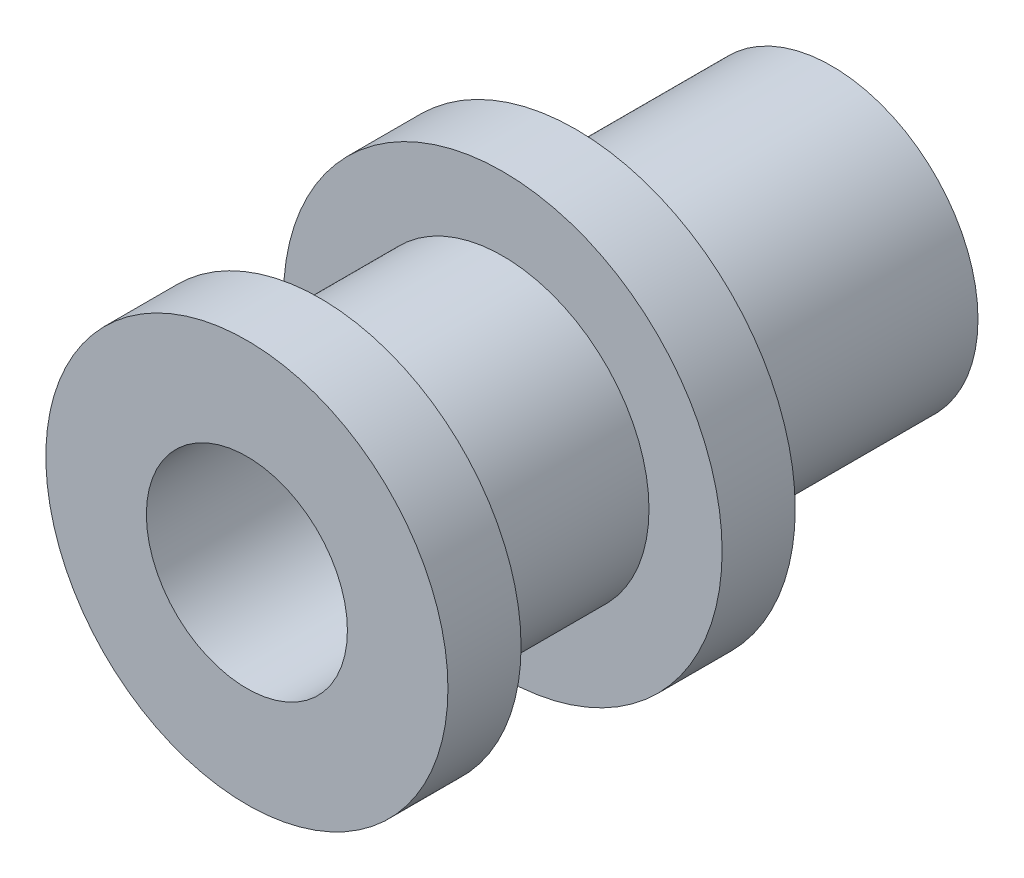
ISO-10303-21;
HEADER;
FILE_DESCRIPTION(('STEP AP214'),'2;1');
FILE_NAME('part.step','',(''),(''),'','','');
FILE_SCHEMA(('AUTOMOTIVE_DESIGN { 1 0 10303 214 1 1 1 1 }'));
ENDSEC;
DATA;
#1=APPLICATION_CONTEXT('core data for automotive mechanical design processes');
#2=APPLICATION_PROTOCOL_DEFINITION('international standard','automotive_design',2000,#1);
#3=PRODUCT_CONTEXT('',#1,'mechanical');
#4=PRODUCT('Part','Part','',(#3));
#5=PRODUCT_RELATED_PRODUCT_CATEGORY('part','',(#4));
#6=PRODUCT_DEFINITION_FORMATION('','',#4);
#7=PRODUCT_DEFINITION_CONTEXT('part definition',#1,'design');
#8=PRODUCT_DEFINITION('design','',#6,#7);
#9=PRODUCT_DEFINITION_SHAPE('','',#8);
#10=(LENGTH_UNIT() NAMED_UNIT(*) SI_UNIT(.MILLI.,.METRE.));
#11=(NAMED_UNIT(*) PLANE_ANGLE_UNIT() SI_UNIT($,.RADIAN.));
#12=(NAMED_UNIT(*) SI_UNIT($,.STERADIAN.) SOLID_ANGLE_UNIT());
#13=UNCERTAINTY_MEASURE_WITH_UNIT(LENGTH_MEASURE(1.E-05),#10,'distance_accuracy_value','');
#14=(GEOMETRIC_REPRESENTATION_CONTEXT(3) GLOBAL_UNCERTAINTY_ASSIGNED_CONTEXT((#13)) GLOBAL_UNIT_ASSIGNED_CONTEXT((#10,
#11,#12)) REPRESENTATION_CONTEXT('',''));
#15=CARTESIAN_POINT('',(0.,0.,0.));
#16=DIRECTION('',(0.,0.,1.));
#17=DIRECTION('',(1.,0.,0.));
#18=AXIS2_PLACEMENT_3D('',#15,#16,#17);
#19=CARTESIAN_POINT('',(0.,0.,2.));
#20=DIRECTION('',(0.,0.,-1.));
#21=DIRECTION('',(-1.,0.,0.));
#22=AXIS2_PLACEMENT_3D('',#19,#20,#21);
#23=CYLINDRICAL_SURFACE('',#22,5.5);
#24=CARTESIAN_POINT('',(0.,0.,2.));
#25=DIRECTION('',(0.,0.,1.));
#26=DIRECTION('',(1.,0.,0.));
#27=AXIS2_PLACEMENT_3D('',#24,#25,#26);
#28=CIRCLE('',#27,5.5);
#29=CARTESIAN_POINT('',(5.5,0.,2.));
#30=VERTEX_POINT('',#29);
#31=EDGE_CURVE('E48',#30,#30,#28,.T.);
#32=ORIENTED_EDGE('',*,*,#31,.F.);
#33=EDGE_LOOP('',(#32));
#34=FACE_BOUND('',#33,.T.);
#35=CARTESIAN_POINT('',(0.,0.,0.));
#36=DIRECTION('',(0.,0.,1.));
#37=DIRECTION('',(1.,0.,0.));
#38=AXIS2_PLACEMENT_3D('',#35,#36,#37);
#39=CIRCLE('',#38,5.5);
#40=CARTESIAN_POINT('',(5.5,0.,0.));
#41=VERTEX_POINT('',#40);
#42=EDGE_CURVE('E55',#41,#41,#39,.T.);
#43=ORIENTED_EDGE('',*,*,#42,.T.);
#44=EDGE_LOOP('',(#43));
#45=FACE_BOUND('',#44,.T.);
#46=ADVANCED_FACE('F41',(#34,#45),#23,.T.);
#47=CARTESIAN_POINT('',(0.,0.,2.));
#48=DIRECTION('',(0.,0.,1.));
#49=DIRECTION('',(1.,0.,0.));
#50=AXIS2_PLACEMENT_3D('',#47,#48,#49);
#51=PLANE('',#50);
#52=CARTESIAN_POINT('',(0.,0.,2.));
#53=DIRECTION('',(0.,0.,1.));
#54=DIRECTION('',(1.,0.,0.));
#55=AXIS2_PLACEMENT_3D('',#52,#53,#54);
#56=CIRCLE('',#55,2.75);
#57=CARTESIAN_POINT('',(2.75,0.,2.));
#58=VERTEX_POINT('',#57);
#59=EDGE_CURVE('E68',#58,#58,#56,.T.);
#60=ORIENTED_EDGE('',*,*,#59,.F.);
#61=EDGE_LOOP('',(#60));
#62=FACE_BOUND('',#61,.T.);
#63=ORIENTED_EDGE('',*,*,#31,.T.);
#64=EDGE_LOOP('',(#63));
#65=FACE_BOUND('',#64,.T.);
#66=ADVANCED_FACE('F83',(#62,#65),#51,.T.);
#67=CARTESIAN_POINT('',(0.,0.,0.));
#68=DIRECTION('',(0.,0.,1.));
#69=DIRECTION('',(1.,0.,0.));
#70=AXIS2_PLACEMENT_3D('',#67,#68,#69);
#71=PLANE('',#70);
#72=CARTESIAN_POINT('',(0.,0.,0.));
#73=DIRECTION('',(0.,0.,1.));
#74=DIRECTION('',(1.,0.,0.));
#75=AXIS2_PLACEMENT_3D('',#72,#73,#74);
#76=CIRCLE('',#75,4.);
#77=CARTESIAN_POINT('',(4.,0.,0.));
#78=VERTEX_POINT('',#77);
#79=EDGE_CURVE('E57',#78,#78,#76,.T.);
#80=ORIENTED_EDGE('',*,*,#79,.T.);
#81=EDGE_LOOP('',(#80));
#82=FACE_BOUND('',#81,.T.);
#83=ORIENTED_EDGE('',*,*,#42,.F.);
#84=EDGE_LOOP('',(#83));
#85=FACE_BOUND('',#84,.T.);
#86=ADVANCED_FACE('F86',(#82,#85),#71,.F.);
#87=CARTESIAN_POINT('',(0.,0.,0.));
#88=DIRECTION('',(0.,0.,-1.));
#89=DIRECTION('',(-1.,0.,0.));
#90=AXIS2_PLACEMENT_3D('',#87,#88,#89);
#91=CYLINDRICAL_SURFACE('',#90,4.);
#92=CARTESIAN_POINT('',(0.,0.,-5.));
#93=DIRECTION('',(0.,0.,1.));
#94=DIRECTION('',(1.,0.,0.));
#95=AXIS2_PLACEMENT_3D('',#92,#93,#94);
#96=CIRCLE('',#95,4.);
#97=CARTESIAN_POINT('',(4.,0.,-5.));
#98=VERTEX_POINT('',#97);
#99=EDGE_CURVE('E42',#98,#98,#96,.T.);
#100=ORIENTED_EDGE('',*,*,#99,.T.);
#101=EDGE_LOOP('',(#100));
#102=FACE_BOUND('',#101,.T.);
#103=ORIENTED_EDGE('',*,*,#79,.F.);
#104=EDGE_LOOP('',(#103));
#105=FACE_BOUND('',#104,.T.);
#106=ADVANCED_FACE('F100',(#102,#105),#91,.T.);
#107=CARTESIAN_POINT('',(0.,0.,-5.));
#108=DIRECTION('',(0.,0.,-1.));
#109=DIRECTION('',(-1.,0.,0.));
#110=AXIS2_PLACEMENT_3D('',#107,#108,#109);
#111=CYLINDRICAL_SURFACE('',#110,6.);
#112=CARTESIAN_POINT('',(0.,0.,-5.));
#113=DIRECTION('',(0.,0.,1.));
#114=DIRECTION('',(1.,0.,0.));
#115=AXIS2_PLACEMENT_3D('',#112,#113,#114);
#116=CIRCLE('',#115,6.);
#117=CARTESIAN_POINT('',(6.,0.,-5.));
#118=VERTEX_POINT('',#117);
#119=EDGE_CURVE('E67',#118,#118,#116,.T.);
#120=ORIENTED_EDGE('',*,*,#119,.F.);
#121=EDGE_LOOP('',(#120));
#122=FACE_BOUND('',#121,.T.);
#123=CARTESIAN_POINT('',(0.,0.,-7.));
#124=DIRECTION('',(0.,0.,1.));
#125=DIRECTION('',(1.,0.,0.));
#126=AXIS2_PLACEMENT_3D('',#123,#124,#125);
#127=CIRCLE('',#126,6.);
#128=CARTESIAN_POINT('',(6.,0.,-7.));
#129=VERTEX_POINT('',#128);
#130=EDGE_CURVE('E62',#129,#129,#127,.T.);
#131=ORIENTED_EDGE('',*,*,#130,.T.);
#132=EDGE_LOOP('',(#131));
#133=FACE_BOUND('',#132,.T.);
#134=ADVANCED_FACE('F103',(#122,#133),#111,.T.);
#135=CARTESIAN_POINT('',(0.,0.,-5.));
#136=DIRECTION('',(0.,0.,1.));
#137=DIRECTION('',(1.,0.,0.));
#138=AXIS2_PLACEMENT_3D('',#135,#136,#137);
#139=PLANE('',#138);
#140=ORIENTED_EDGE('',*,*,#99,.F.);
#141=EDGE_LOOP('',(#140));
#142=FACE_BOUND('',#141,.T.);
#143=ORIENTED_EDGE('',*,*,#119,.T.);
#144=EDGE_LOOP('',(#143));
#145=FACE_BOUND('',#144,.T.);
#146=ADVANCED_FACE('F114',(#142,#145),#139,.T.);
#147=CARTESIAN_POINT('',(0.,0.,-7.));
#148=DIRECTION('',(0.,0.,1.));
#149=DIRECTION('',(1.,0.,0.));
#150=AXIS2_PLACEMENT_3D('',#147,#148,#149);
#151=PLANE('',#150);
#152=CARTESIAN_POINT('',(0.,0.,-7.));
#153=DIRECTION('',(0.,0.,1.));
#154=DIRECTION('',(1.,0.,0.));
#155=AXIS2_PLACEMENT_3D('',#152,#153,#154);
#156=CIRCLE('',#155,4.);
#157=CARTESIAN_POINT('',(4.,0.,-7.));
#158=VERTEX_POINT('',#157);
#159=EDGE_CURVE('E10',#158,#158,#156,.T.);
#160=ORIENTED_EDGE('',*,*,#159,.T.);
#161=EDGE_LOOP('',(#160));
#162=FACE_BOUND('',#161,.T.);
#163=ORIENTED_EDGE('',*,*,#130,.F.);
#164=EDGE_LOOP('',(#163));
#165=FACE_BOUND('',#164,.T.);
#166=ADVANCED_FACE('F108',(#162,#165),#151,.F.);
#167=CARTESIAN_POINT('',(0.,0.,-14.));
#168=DIRECTION('',(0.,0.,1.));
#169=DIRECTION('',(1.,0.,0.));
#170=AXIS2_PLACEMENT_3D('',#167,#168,#169);
#171=PLANE('',#170);
#172=CARTESIAN_POINT('',(0.,0.,-14.));
#173=DIRECTION('',(0.,0.,1.));
#174=DIRECTION('',(1.,0.,0.));
#175=AXIS2_PLACEMENT_3D('',#172,#173,#174);
#176=CIRCLE('',#175,4.);
#177=CARTESIAN_POINT('',(4.,0.,-14.));
#178=VERTEX_POINT('',#177);
#179=EDGE_CURVE('E59',#178,#178,#176,.T.);
#180=ORIENTED_EDGE('',*,*,#179,.F.);
#181=EDGE_LOOP('',(#180));
#182=FACE_BOUND('',#181,.T.);
#183=ADVANCED_FACE('F110',(#182),#171,.F.);
#184=ORIENTED_EDGE('',*,*,#179,.T.);
#185=EDGE_LOOP('',(#184));
#186=FACE_BOUND('',#185,.T.);
#187=ORIENTED_EDGE('',*,*,#159,.F.);
#188=EDGE_LOOP('',(#187));
#189=FACE_BOUND('',#188,.T.);
#190=ADVANCED_FACE('F82',(#186,#189),#91,.T.);
#191=CARTESIAN_POINT('',(0.,0.,-8.));
#192=DIRECTION('',(0.,0.,1.));
#193=DIRECTION('',(1.,0.,0.));
#194=AXIS2_PLACEMENT_3D('',#191,#192,#193);
#195=CYLINDRICAL_SURFACE('',#194,2.75);
#196=CARTESIAN_POINT('',(0.,0.,-8.));
#197=DIRECTION('',(0.,0.,1.));
#198=DIRECTION('',(1.,0.,0.));
#199=AXIS2_PLACEMENT_3D('',#196,#197,#198);
#200=CIRCLE('',#199,2.75);
#201=CARTESIAN_POINT('',(2.75,0.,-8.));
#202=VERTEX_POINT('',#201);
#203=EDGE_CURVE('E70',#202,#202,#200,.T.);
#204=ORIENTED_EDGE('',*,*,#203,.F.);
#205=EDGE_LOOP('',(#204));
#206=FACE_BOUND('',#205,.T.);
#207=ORIENTED_EDGE('',*,*,#59,.T.);
#208=EDGE_LOOP('',(#207));
#209=FACE_BOUND('',#208,.T.);
#210=ADVANCED_FACE('F77',(#206,#209),#195,.F.);
#211=CARTESIAN_POINT('',(0.,0.,-8.));
#212=DIRECTION('',(0.,0.,1.));
#213=DIRECTION('',(1.,0.,0.));
#214=AXIS2_PLACEMENT_3D('',#211,#212,#213);
#215=PLANE('',#214);
#216=ORIENTED_EDGE('',*,*,#203,.T.);
#217=EDGE_LOOP('',(#216));
#218=FACE_BOUND('',#217,.T.);
#219=ADVANCED_FACE('F78',(#218),#215,.T.);
#220=CLOSED_SHELL('',(#46,#66,#86,#106,#134,#146,#166,#183,#190,#210,#219));
#221=MANIFOLD_SOLID_BREP('B2',#220);
#222=ADVANCED_BREP_SHAPE_REPRESENTATION('',(#18,#221),#14);
#223=SHAPE_DEFINITION_REPRESENTATION(#9,#222);
ENDSEC;
END-ISO-10303-21;
